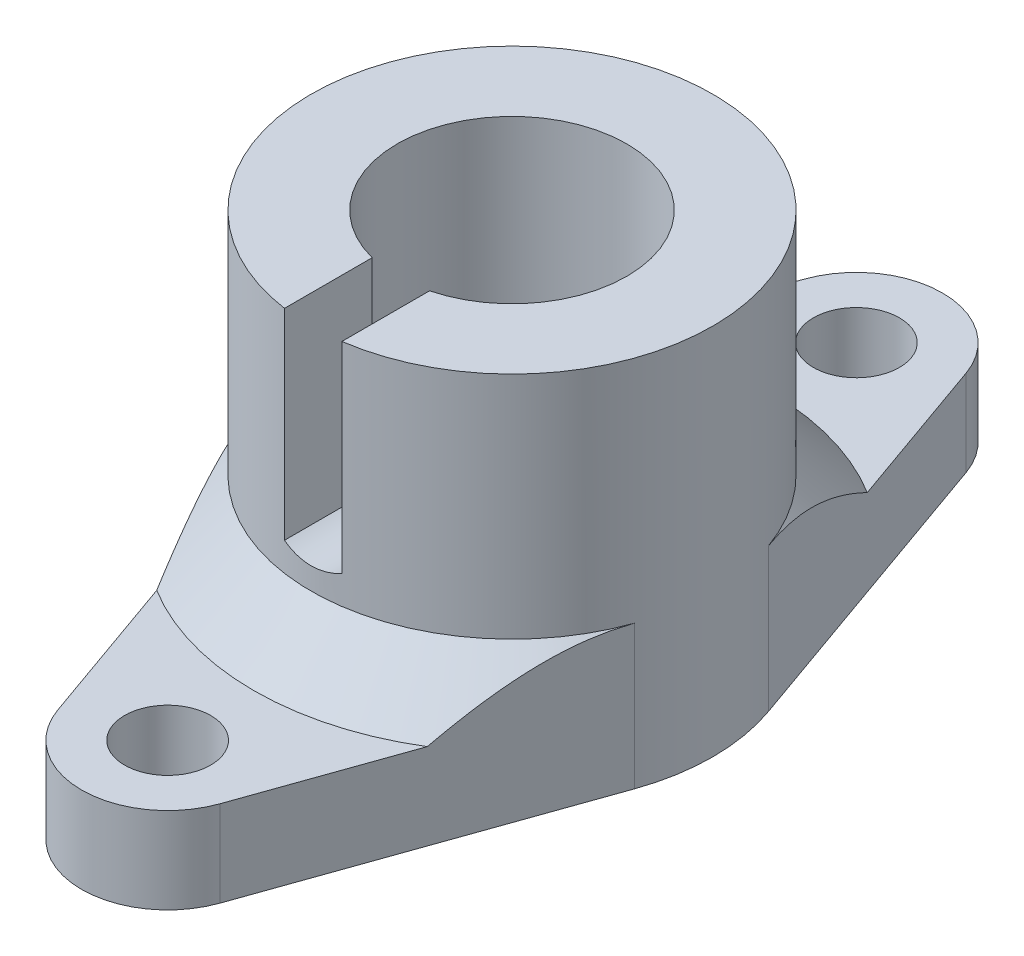
ISO-10303-21;
HEADER;
FILE_DESCRIPTION(('STEP AP214'),'2;1');
FILE_NAME('part.step','',(''),(''),'','','');
FILE_SCHEMA(('AUTOMOTIVE_DESIGN { 1 0 10303 214 1 1 1 1 }'));
ENDSEC;
DATA;
#1=APPLICATION_CONTEXT('core data for automotive mechanical design processes');
#2=APPLICATION_PROTOCOL_DEFINITION('international standard','automotive_design',2000,#1);
#3=PRODUCT_CONTEXT('',#1,'mechanical');
#4=PRODUCT('Part','Part','',(#3));
#5=PRODUCT_RELATED_PRODUCT_CATEGORY('part','',(#4));
#6=PRODUCT_DEFINITION_FORMATION('','',#4);
#7=PRODUCT_DEFINITION_CONTEXT('part definition',#1,'design');
#8=PRODUCT_DEFINITION('design','',#6,#7);
#9=PRODUCT_DEFINITION_SHAPE('','',#8);
#10=(LENGTH_UNIT() NAMED_UNIT(*) SI_UNIT(.MILLI.,.METRE.));
#11=(NAMED_UNIT(*) PLANE_ANGLE_UNIT() SI_UNIT($,.RADIAN.));
#12=(NAMED_UNIT(*) SI_UNIT($,.STERADIAN.) SOLID_ANGLE_UNIT());
#13=UNCERTAINTY_MEASURE_WITH_UNIT(LENGTH_MEASURE(1.E-05),#10,'distance_accuracy_value','');
#14=(GEOMETRIC_REPRESENTATION_CONTEXT(3) GLOBAL_UNCERTAINTY_ASSIGNED_CONTEXT((#13)) GLOBAL_UNIT_ASSIGNED_CONTEXT((#10,
#11,#12)) REPRESENTATION_CONTEXT('',''));
#15=CARTESIAN_POINT('',(0.,0.,0.));
#16=DIRECTION('',(0.,0.,1.));
#17=DIRECTION('',(1.,0.,0.));
#18=AXIS2_PLACEMENT_3D('',#15,#16,#17);
#19=CARTESIAN_POINT('',(0.,10.,0.));
#20=DIRECTION('',(0.,1.,0.));
#21=DIRECTION('',(0.,0.,1.));
#22=AXIS2_PLACEMENT_3D('',#19,#20,#21);
#23=PLANE('',#22);
#24=DIRECTION('',(0.,0.,1.));
#25=VECTOR('',#24,1.);
#26=CARTESIAN_POINT('',(-1.,10.,7.));
#27=LINE('',#26,#25);
#28=CARTESIAN_POINT('',(-1.,10.,3.87298334620742));
#29=VERTEX_POINT('',#28);
#30=CARTESIAN_POINT('',(-1.,10.,6.92820323027551));
#31=VERTEX_POINT('',#30);
#32=EDGE_CURVE('E186',#29,#31,#27,.T.);
#33=ORIENTED_EDGE('',*,*,#32,.F.);
#34=CARTESIAN_POINT('',(0.,10.,0.));
#35=DIRECTION('',(0.,1.,0.));
#36=DIRECTION('',(0.,0.,1.));
#37=AXIS2_PLACEMENT_3D('',#34,#35,#36);
#38=CIRCLE('',#37,4.);
#39=CARTESIAN_POINT('',(1.,10.,3.87298334620742));
#40=VERTEX_POINT('',#39);
#41=EDGE_CURVE('E245',#40,#29,#38,.T.);
#42=ORIENTED_EDGE('',*,*,#41,.F.);
#43=DIRECTION('',(0.,0.,1.));
#44=VECTOR('',#43,1.);
#45=CARTESIAN_POINT('',(1.,10.,7.));
#46=LINE('',#45,#44);
#47=CARTESIAN_POINT('',(1.,10.,6.92820323027551));
#48=VERTEX_POINT('',#47);
#49=EDGE_CURVE('E189',#40,#48,#46,.T.);
#50=ORIENTED_EDGE('',*,*,#49,.T.);
#51=CARTESIAN_POINT('',(0.,10.,0.));
#52=DIRECTION('',(0.,1.,0.));
#53=DIRECTION('',(0.,0.,1.));
#54=AXIS2_PLACEMENT_3D('',#51,#52,#53);
#55=CIRCLE('',#54,7.);
#56=EDGE_CURVE('E228',#48,#31,#55,.T.);
#57=ORIENTED_EDGE('',*,*,#56,.T.);
#58=EDGE_LOOP('',(#33,#42,#50,#57));
#59=FACE_BOUND('',#58,.T.);
#60=ADVANCED_FACE('F44',(#59),#23,.T.);
#61=CARTESIAN_POINT('',(0.,10.,0.));
#62=DIRECTION('',(0.,-1.,0.));
#63=DIRECTION('',(0.,0.,-1.));
#64=AXIS2_PLACEMENT_3D('',#61,#62,#63);
#65=CYLINDRICAL_SURFACE('',#64,7.);
#66=CARTESIAN_POINT('',(1.,3.,6.92820323027551));
#67=CARTESIAN_POINT('',(0.946010806745878,2.97300649768495,6.93599801640342));
#68=CARTESIAN_POINT('',(0.890894552130974,2.94818190206135,6.9433060423228));
#69=CARTESIAN_POINT('',(0.778705426420527,2.90303081568562,6.95678158016357));
#70=CARTESIAN_POINT('',(0.721632250509211,2.88270502939087,6.96294891344191));
#71=CARTESIAN_POINT('',(0.548208676947282,2.82880857866341,6.97946117582955));
#72=CARTESIAN_POINT('',(0.429409920284121,2.80219662615952,6.98785273447074));
#73=CARTESIAN_POINT('',(0.188623589553656,2.76857830678596,6.99849899477172));
#74=CARTESIAN_POINT('',(0.0666305435886491,2.76160815212066,7.0007423612323));
#75=CARTESIAN_POINT('',(-0.176793022976455,2.76761291838919,6.99882421205708));
#76=CARTESIAN_POINT('',(-0.298223713298514,2.78058136670916,6.99466477494525));
#77=CARTESIAN_POINT('',(-0.518906818506631,2.82252959364398,6.98147978008605));
#78=CARTESIAN_POINT('',(-0.618733573987294,2.84878796606671,6.97328630421981));
#79=CARTESIAN_POINT('',(-0.764761919896258,2.89814672865556,6.9582717606271));
#80=CARTESIAN_POINT('',(-0.812838014642447,2.91627082585687,6.95281010910982));
#81=CARTESIAN_POINT('',(-0.907548197136564,2.95574282698545,6.94108319991622));
#82=CARTESIAN_POINT('',(-0.954182269750846,2.97709076473224,6.93481793380972));
#83=CARTESIAN_POINT('',(-0.999999999999999,3.,6.92820323027551));
#84=B_SPLINE_CURVE_WITH_KNOTS('',3,(#66,#67,#68,#69,#70,#71,#72,#73,#74,#75,#76,#77,#78,#79,#80,
#81,#82,#83),.UNSPECIFIED.,.F.,.F.,(4,2,2,2,2,2,2,2,4),(0.,0.182484883344135,0.364998321358469,
0.729208729260032,1.09409016841291,1.45885318211515,1.76839055356223,1.92328403407926,
2.07817913961168),.UNSPECIFIED.);
#85=CARTESIAN_POINT('',(1.,3.,6.92820323027551));
#86=VERTEX_POINT('',#85);
#87=CARTESIAN_POINT('',(-0.999999999999999,3.,6.92820323027551));
#88=VERTEX_POINT('',#87);
#89=EDGE_CURVE('E188',#86,#88,#84,.T.);
#90=ORIENTED_EDGE('',*,*,#89,.T.);
#91=DIRECTION('',(0.,-1.,0.));
#92=VECTOR('',#91,1.);
#93=CARTESIAN_POINT('',(-1.,10.,6.92820323027551));
#94=LINE('',#93,#92);
#95=EDGE_CURVE('E258',#88,#31,#94,.F.);
#96=ORIENTED_EDGE('',*,*,#95,.T.);
#97=ORIENTED_EDGE('',*,*,#56,.F.);
#98=DIRECTION('',(0.,-1.,0.));
#99=VECTOR('',#98,1.);
#100=CARTESIAN_POINT('',(1.,10.,6.92820323027551));
#101=LINE('',#100,#99);
#102=EDGE_CURVE('E202',#86,#48,#101,.F.);
#103=ORIENTED_EDGE('',*,*,#102,.F.);
#104=EDGE_LOOP('',(#90,#96,#97,#103));
#105=FACE_BOUND('',#104,.T.);
#106=CARTESIAN_POINT('',(0.,2.,0.));
#107=DIRECTION('',(0.,-1.,0.));
#108=DIRECTION('',(0.,0.,-1.));
#109=AXIS2_PLACEMENT_3D('',#106,#107,#108);
#110=CIRCLE('',#109,7.);
#111=CARTESIAN_POINT('',(6.59966329107445,2.,-2.33333333333334));
#112=VERTEX_POINT('',#111);
#113=CARTESIAN_POINT('',(-6.59966329107444,2.,-2.33333333333333));
#114=VERTEX_POINT('',#113);
#115=EDGE_CURVE('E265',#112,#114,#110,.F.);
#116=ORIENTED_EDGE('',*,*,#115,.T.);
#117=DIRECTION('',(0.,1.,0.));
#118=VECTOR('',#117,1.);
#119=CARTESIAN_POINT('',(-6.59966329107445,-3.,-2.33333333333334));
#120=LINE('',#119,#118);
#121=CARTESIAN_POINT('',(-6.59966329107445,-3.,-2.33333333333334));
#122=VERTEX_POINT('',#121);
#123=EDGE_CURVE('E267',#122,#114,#120,.T.);
#124=ORIENTED_EDGE('',*,*,#123,.F.);
#125=CARTESIAN_POINT('',(0.,-3.,0.));
#126=DIRECTION('',(0.,-1.,0.));
#127=DIRECTION('',(0.,0.,-1.));
#128=AXIS2_PLACEMENT_3D('',#125,#126,#127);
#129=CIRCLE('',#128,7.);
#130=CARTESIAN_POINT('',(-6.59966329107445,-3.,2.33333333333334));
#131=VERTEX_POINT('',#130);
#132=EDGE_CURVE('E340',#131,#122,#129,.T.);
#133=ORIENTED_EDGE('',*,*,#132,.F.);
#134=DIRECTION('',(0.,1.,0.));
#135=VECTOR('',#134,1.);
#136=CARTESIAN_POINT('',(-6.59966329107445,-3.,2.33333333333334));
#137=LINE('',#136,#135);
#138=CARTESIAN_POINT('',(-6.59966329107445,2.,2.33333333333334));
#139=VERTEX_POINT('',#138);
#140=EDGE_CURVE('E182',#131,#139,#137,.T.);
#141=ORIENTED_EDGE('',*,*,#140,.T.);
#142=CARTESIAN_POINT('',(0.,2.,0.));
#143=DIRECTION('',(0.,-1.,0.));
#144=DIRECTION('',(0.,0.,-1.));
#145=AXIS2_PLACEMENT_3D('',#142,#143,#144);
#146=CIRCLE('',#145,7.);
#147=CARTESIAN_POINT('',(6.59966329107444,2.,2.33333333333333));
#148=VERTEX_POINT('',#147);
#149=EDGE_CURVE('E275',#139,#148,#146,.F.);
#150=ORIENTED_EDGE('',*,*,#149,.T.);
#151=DIRECTION('',(0.,1.,0.));
#152=VECTOR('',#151,1.);
#153=CARTESIAN_POINT('',(6.59966329107445,-3.,2.33333333333334));
#154=LINE('',#153,#152);
#155=CARTESIAN_POINT('',(6.59966329107445,-3.,2.33333333333334));
#156=VERTEX_POINT('',#155);
#157=EDGE_CURVE('E339',#156,#148,#154,.T.);
#158=ORIENTED_EDGE('',*,*,#157,.F.);
#159=CARTESIAN_POINT('',(6.59966329107445,-3.,-2.33333333333334));
#160=VERTEX_POINT('',#159);
#161=EDGE_CURVE('E170',#160,#156,#129,.T.);
#162=ORIENTED_EDGE('',*,*,#161,.F.);
#163=DIRECTION('',(0.,1.,0.));
#164=VECTOR('',#163,1.);
#165=CARTESIAN_POINT('',(6.59966329107445,-3.,-2.33333333333334));
#166=LINE('',#165,#164);
#167=EDGE_CURVE('E269',#160,#112,#166,.T.);
#168=ORIENTED_EDGE('',*,*,#167,.T.);
#169=EDGE_LOOP('',(#116,#124,#133,#141,#150,#158,#162,#168));
#170=FACE_BOUND('',#169,.T.);
#171=ADVANCED_FACE('F204',(#105,#170),#65,.T.);
#172=CARTESIAN_POINT('',(0.,10.,0.));
#173=DIRECTION('',(0.,-1.,0.));
#174=DIRECTION('',(0.,0.,-1.));
#175=AXIS2_PLACEMENT_3D('',#172,#173,#174);
#176=CYLINDRICAL_SURFACE('',#175,4.);
#177=DIRECTION('',(0.,-1.,0.));
#178=VECTOR('',#177,1.);
#179=CARTESIAN_POINT('',(-1.,10.,3.87298334620742));
#180=LINE('',#179,#178);
#181=CARTESIAN_POINT('',(-0.999999999999999,3.,3.87298334620742));
#182=VERTEX_POINT('',#181);
#183=EDGE_CURVE('E253',#182,#29,#180,.F.);
#184=ORIENTED_EDGE('',*,*,#183,.F.);
#185=CARTESIAN_POINT('',(1.,3.,3.87298334620742));
#186=CARTESIAN_POINT('',(0.950188517099722,2.97508933958767,3.88585088189177));
#187=CARTESIAN_POINT('',(0.899277846788459,2.95196544868543,3.89796465323832));
#188=CARTESIAN_POINT('',(0.795514839442824,2.90947468734503,3.92045447989143));
#189=CARTESIAN_POINT('',(0.742661636034023,2.89010951809513,3.93082974806663));
#190=CARTESIAN_POINT('',(0.635411059299217,2.85537339290339,3.94958367100883));
#191=CARTESIAN_POINT('',(0.58101659433077,2.83999540612524,3.95796583813448));
#192=CARTESIAN_POINT('',(0.470967036450821,2.81335871011157,3.97256569752814));
#193=CARTESIAN_POINT('',(0.415312156422224,2.8020993106799,3.97878375245131));
#194=CARTESIAN_POINT('',(0.246582686802666,2.77465156165259,3.99398572969428));
#195=CARTESIAN_POINT('',(0.132048493849422,2.76489306891693,3.99946281301305));
#196=CARTESIAN_POINT('',(-0.0972094396441492,2.76310668058718,4.00046132666002));
#197=CARTESIAN_POINT('',(-0.211933193699685,2.7710801090207,3.9959820135525));
#198=CARTESIAN_POINT('',(-0.384039280941791,2.79634259434987,3.98196747194808));
#199=CARTESIAN_POINT('',(-0.442706272556058,2.80738554503555,3.97585667456761));
#200=CARTESIAN_POINT('',(-0.558714272249034,2.83404165072753,3.96121815743422));
#201=CARTESIAN_POINT('',(-0.616054947088828,2.84965594111546,3.95268983725895));
#202=CARTESIAN_POINT('',(-0.729103681035262,2.88530615865487,3.93340858219508));
#203=CARTESIAN_POINT('',(-0.784807518595089,2.90535254622222,3.92265038828784));
#204=CARTESIAN_POINT('',(-0.894078921624876,2.94960941824284,3.89919979606198));
#205=CARTESIAN_POINT('',(-0.94764766335125,2.97381756973795,3.88650848184369));
#206=CARTESIAN_POINT('',(-0.999999999999999,3.,3.87298334620742));
#207=B_SPLINE_CURVE_WITH_KNOTS('',3,(#185,#186,#187,#188,#189,#190,#191,#192,#193,#194,#195,
#196,#197,#198,#199,#200,#201,#202,#203,#204,#205,#206),.UNSPECIFIED.,.F.,.F.,(4,2,2,2,2,2,2,2,
2,2,4),(0.,0.171451164096802,0.342979746548265,0.514203773126166,0.685399092685342,
1.02875375332103,1.37213405282071,1.55195811410159,1.7318268761507,1.91212477538504,
2.09232193271541),.UNSPECIFIED.);
#208=CARTESIAN_POINT('',(1.,3.,3.87298334620742));
#209=VERTEX_POINT('',#208);
#210=EDGE_CURVE('E220',#209,#182,#207,.T.);
#211=ORIENTED_EDGE('',*,*,#210,.F.);
#212=DIRECTION('',(0.,-1.,0.));
#213=VECTOR('',#212,1.);
#214=CARTESIAN_POINT('',(1.,10.,3.87298334620742));
#215=LINE('',#214,#213);
#216=EDGE_CURVE('E227',#209,#40,#215,.F.);
#217=ORIENTED_EDGE('',*,*,#216,.T.);
#218=ORIENTED_EDGE('',*,*,#41,.T.);
#219=EDGE_LOOP('',(#184,#211,#217,#218));
#220=FACE_BOUND('',#219,.T.);
#221=CARTESIAN_POINT('',(0.,0.,0.));
#222=DIRECTION('',(0.,1.,0.));
#223=DIRECTION('',(0.,0.,1.));
#224=AXIS2_PLACEMENT_3D('',#221,#222,#223);
#225=CIRCLE('',#224,4.);
#226=CARTESIAN_POINT('',(0.,0.,4.));
#227=VERTEX_POINT('',#226);
#228=EDGE_CURVE('E255',#227,#227,#225,.T.);
#229=ORIENTED_EDGE('',*,*,#228,.F.);
#230=EDGE_LOOP('',(#229));
#231=FACE_BOUND('',#230,.T.);
#232=ADVANCED_FACE('F231',(#220,#231),#176,.F.);
#233=CARTESIAN_POINT('',(-0.999999999999999,0.,7.));
#234=DIRECTION('',(-1.,0.,0.));
#235=DIRECTION('',(0.,-1.,0.));
#236=AXIS2_PLACEMENT_3D('',#233,#234,#235);
#237=PLANE('',#236);
#238=DIRECTION('',(0.,0.,1.));
#239=VECTOR('',#238,1.);
#240=CARTESIAN_POINT('',(-0.999999999999999,3.,7.));
#241=LINE('',#240,#239);
#242=EDGE_CURVE('E177',#182,#88,#241,.T.);
#243=ORIENTED_EDGE('',*,*,#242,.F.);
#244=ORIENTED_EDGE('',*,*,#183,.T.);
#245=ORIENTED_EDGE('',*,*,#32,.T.);
#246=ORIENTED_EDGE('',*,*,#95,.F.);
#247=EDGE_LOOP('',(#243,#244,#245,#246));
#248=FACE_BOUND('',#247,.T.);
#249=ADVANCED_FACE('F216',(#248),#237,.F.);
#250=CARTESIAN_POINT('',(1.,0.,7.));
#251=DIRECTION('',(-1.,0.,0.));
#252=DIRECTION('',(0.,-1.,0.));
#253=AXIS2_PLACEMENT_3D('',#250,#251,#252);
#254=PLANE('',#253);
#255=ORIENTED_EDGE('',*,*,#102,.T.);
#256=ORIENTED_EDGE('',*,*,#49,.F.);
#257=ORIENTED_EDGE('',*,*,#216,.F.);
#258=DIRECTION('',(0.,0.,1.));
#259=VECTOR('',#258,1.);
#260=CARTESIAN_POINT('',(1.,3.,7.));
#261=LINE('',#260,#259);
#262=EDGE_CURVE('E180',#209,#86,#261,.T.);
#263=ORIENTED_EDGE('',*,*,#262,.T.);
#264=EDGE_LOOP('',(#255,#256,#257,#263));
#265=FACE_BOUND('',#264,.T.);
#266=ADVANCED_FACE('F213',(#265),#254,.T.);
#267=CARTESIAN_POINT('',(0.,5.00000000000006,7.));
#268=DIRECTION('',(0.,0.,1.));
#269=DIRECTION('',(1.,0.,0.));
#270=AXIS2_PLACEMENT_3D('',#267,#268,#269);
#271=CYLINDRICAL_SURFACE('',#270,2.23606797749984);
#272=ORIENTED_EDGE('',*,*,#262,.F.);
#273=ORIENTED_EDGE('',*,*,#210,.T.);
#274=ORIENTED_EDGE('',*,*,#242,.T.);
#275=ORIENTED_EDGE('',*,*,#89,.F.);
#276=EDGE_LOOP('',(#272,#273,#274,#275));
#277=FACE_BOUND('',#276,.T.);
#278=ADVANCED_FACE('F207',(#277),#271,.F.);
#279=CARTESIAN_POINT('',(0.,0.,0.));
#280=DIRECTION('',(0.,-1.,0.));
#281=DIRECTION('',(0.,0.,-1.));
#282=AXIS2_PLACEMENT_3D('',#279,#280,#281);
#283=PLANE('',#282);
#284=ORIENTED_EDGE('',*,*,#228,.T.);
#285=EDGE_LOOP('',(#284));
#286=FACE_BOUND('',#285,.T.);
#287=ADVANCED_FACE('F212',(#286),#283,.F.);
#288=DIRECTION('',(0.333333333333334,0.,-0.942809041582063));
#289=VECTOR('',#288,1.);
#290=CARTESIAN_POINT('',(-6.59966329107445,0.,-2.33333333333334));
#291=LINE('',#290,#289);
#292=CARTESIAN_POINT('',(-4.71404520791033,0.,-7.66666666666664));
#293=VERTEX_POINT('',#292);
#294=CARTESIAN_POINT('',(-2.82842712474619,0.,-13.));
#295=VERTEX_POINT('',#294);
#296=EDGE_CURVE('E336',#293,#295,#291,.T.);
#297=ORIENTED_EDGE('',*,*,#296,.F.);
#298=CARTESIAN_POINT('',(0.,0.,0.));
#299=DIRECTION('',(0.,-1.,0.));
#300=DIRECTION('',(0.,0.,-1.));
#301=AXIS2_PLACEMENT_3D('',#298,#299,#300);
#302=CIRCLE('',#301,8.99999999999998);
#303=CARTESIAN_POINT('',(4.71404520791033,0.,-7.66666666666664));
#304=VERTEX_POINT('',#303);
#305=EDGE_CURVE('E274',#293,#304,#302,.T.);
#306=ORIENTED_EDGE('',*,*,#305,.T.);
#307=DIRECTION('',(-0.333333333333334,0.,-0.942809041582063));
#308=VECTOR('',#307,1.);
#309=CARTESIAN_POINT('',(6.59966329107445,0.,-2.33333333333334));
#310=LINE('',#309,#308);
#311=CARTESIAN_POINT('',(2.82842712474619,0.,-13.));
#312=VERTEX_POINT('',#311);
#313=EDGE_CURVE('E357',#304,#312,#310,.T.);
#314=ORIENTED_EDGE('',*,*,#313,.T.);
#315=CARTESIAN_POINT('',(0.,0.,-12.));
#316=DIRECTION('',(0.,-1.,0.));
#317=DIRECTION('',(0.,0.,-1.));
#318=AXIS2_PLACEMENT_3D('',#315,#316,#317);
#319=CIRCLE('',#318,3.);
#320=EDGE_CURVE('E359',#312,#295,#319,.F.);
#321=ORIENTED_EDGE('',*,*,#320,.T.);
#322=EDGE_LOOP('',(#297,#306,#314,#321));
#323=FACE_BOUND('',#322,.T.);
#324=CARTESIAN_POINT('',(0.,0.,-12.));
#325=DIRECTION('',(0.,-1.,0.));
#326=DIRECTION('',(0.,0.,-1.));
#327=AXIS2_PLACEMENT_3D('',#324,#325,#326);
#328=CIRCLE('',#327,1.5);
#329=CARTESIAN_POINT('',(0.,0.,-13.5));
#330=VERTEX_POINT('',#329);
#331=EDGE_CURVE('E354',#330,#330,#328,.F.);
#332=ORIENTED_EDGE('',*,*,#331,.F.);
#333=EDGE_LOOP('',(#332));
#334=FACE_BOUND('',#333,.T.);
#335=ADVANCED_FACE('F312',(#323,#334),#283,.F.);
#336=CARTESIAN_POINT('',(6.59966329107445,-3.,2.33333333333334));
#337=DIRECTION('',(-0.942809041582063,0.,-0.333333333333334));
#338=DIRECTION('',(-0.333333333333334,0.,0.942809041582063));
#339=AXIS2_PLACEMENT_3D('',#336,#337,#338);
#340=PLANE('',#339);
#341=ORIENTED_EDGE('',*,*,#157,.T.);
#342=CARTESIAN_POINT('',(6.59966329107444,2.,2.33333333333333));
#343=CARTESIAN_POINT('',(6.56379083725605,2.00001252856495,2.43479595474449));
#344=CARTESIAN_POINT('',(6.52791982372579,1.997518581247,2.53625450240561));
#345=CARTESIAN_POINT('',(6.45625900047216,1.98761085194684,2.73894191867782));
#346=CARTESIAN_POINT('',(6.42046917850424,1.9801978692311,2.84017082192172));
#347=CARTESIAN_POINT('',(6.34910575868481,1.96056394846722,3.04201705425366));
#348=CARTESIAN_POINT('',(6.31353187800726,1.94835224521634,3.14263518329453));
#349=CARTESIAN_POINT('',(6.24259639218225,1.91929704387491,3.34327103550903));
#350=CARTESIAN_POINT('',(6.20723479393475,1.90245339605306,3.44328873916662));
#351=CARTESIAN_POINT('',(6.10275257038662,1.84594004242407,3.73880909430395));
#352=CARTESIAN_POINT('',(6.03400415131753,1.7999340513034,3.93325898758238));
#353=CARTESIAN_POINT('',(5.89782251375967,1.69286069519509,4.31843882514339));
#354=CARTESIAN_POINT('',(5.83038983813374,1.63178724962269,4.50916723397799));
#355=CARTESIAN_POINT('',(5.67207528985783,1.47159934543801,4.95694839656352));
#356=CARTESIAN_POINT('',(5.58183510686107,1.36679447065154,5.21218617789361));
#357=CARTESIAN_POINT('',(5.40402064612393,1.13820382528847,5.71512142181465));
#358=CARTESIAN_POINT('',(5.31644880426343,1.01440129962642,5.96281199469686));
#359=CARTESIAN_POINT('',(5.18587438798423,0.816105480123807,6.33213221549887));
#360=CARTESIAN_POINT('',(5.14194996805534,0.746985317372526,6.45636923626449));
#361=CARTESIAN_POINT('',(5.05470672419915,0.60536505249335,6.70313039363816));
#362=CARTESIAN_POINT('',(5.01138793220835,0.532864772989571,6.82565443991619));
#363=CARTESIAN_POINT('',(4.92542954980956,0.385106933546214,7.06878146029224));
#364=CARTESIAN_POINT('',(4.88278847215458,0.309857130755406,7.18938864096));
#365=CARTESIAN_POINT('',(4.79803399039657,0.156779211984358,7.42911051610814));
#366=CARTESIAN_POINT('',(4.75592048970203,0.0789515777635421,7.54822548379061));
#367=CARTESIAN_POINT('',(4.71404520791033,0.,7.66666666666664));
#368=B_SPLINE_CURVE_WITH_KNOTS('',3,(#342,#343,#344,#345,#346,#347,#348,#349,#350,#351,#352,
#353,#354,#355,#356,#357,#358,#359,#360,#361,#362,#363,#364,#365,#366,#367),.UNSPECIFIED.,.F.,
.F.,(4,2,2,2,2,2,2,2,2,2,2,2,4),(0.,0.32281601580541,0.645579591886596,0.967725050511757,
1.28988092396918,1.92310450959943,2.55658405658534,3.42650233622971,4.29719230226453,
4.74355585015585,5.18994284795931,5.63515527566267,6.08028496392075),.UNSPECIFIED.);
#369=CARTESIAN_POINT('',(4.71404520791033,0.,7.66666666666664));
#370=VERTEX_POINT('',#369);
#371=EDGE_CURVE('E59',#148,#370,#368,.T.);
#372=ORIENTED_EDGE('',*,*,#371,.T.);
#373=DIRECTION('',(-0.333333333333334,0.,0.942809041582063));
#374=VECTOR('',#373,1.);
#375=CARTESIAN_POINT('',(6.59966329107445,0.,2.33333333333334));
#376=LINE('',#375,#374);
#377=CARTESIAN_POINT('',(2.82842712474619,0.,13.));
#378=VERTEX_POINT('',#377);
#379=EDGE_CURVE('E175',#370,#378,#376,.T.);
#380=ORIENTED_EDGE('',*,*,#379,.T.);
#381=DIRECTION('',(0.,1.,0.));
#382=VECTOR('',#381,1.);
#383=CARTESIAN_POINT('',(2.82842712474619,-3.,13.));
#384=LINE('',#383,#382);
#385=CARTESIAN_POINT('',(2.82842712474619,-3.,13.));
#386=VERTEX_POINT('',#385);
#387=EDGE_CURVE('E156',#386,#378,#384,.T.);
#388=ORIENTED_EDGE('',*,*,#387,.F.);
#389=DIRECTION('',(-0.333333333333334,0.,0.942809041582063));
#390=VECTOR('',#389,1.);
#391=CARTESIAN_POINT('',(6.59966329107445,-3.,2.33333333333334));
#392=LINE('',#391,#390);
#393=EDGE_CURVE('E163',#156,#386,#392,.T.);
#394=ORIENTED_EDGE('',*,*,#393,.F.);
#395=EDGE_LOOP('',(#341,#372,#380,#388,#394));
#396=FACE_BOUND('',#395,.T.);
#397=ADVANCED_FACE('F174',(#396),#340,.F.);
#398=CARTESIAN_POINT('',(0.,-3.,12.));
#399=DIRECTION('',(0.,1.,0.));
#400=DIRECTION('',(0.,0.,1.));
#401=AXIS2_PLACEMENT_3D('',#398,#399,#400);
#402=CYLINDRICAL_SURFACE('',#401,3.);
#403=CARTESIAN_POINT('',(0.,0.,12.));
#404=DIRECTION('',(0.,-1.,0.));
#405=DIRECTION('',(0.,0.,-1.));
#406=AXIS2_PLACEMENT_3D('',#403,#404,#405);
#407=CIRCLE('',#406,3.);
#408=CARTESIAN_POINT('',(-2.82842712474619,0.,13.));
#409=VERTEX_POINT('',#408);
#410=EDGE_CURVE('E337',#378,#409,#407,.T.);
#411=ORIENTED_EDGE('',*,*,#410,.T.);
#412=DIRECTION('',(0.,1.,0.));
#413=VECTOR('',#412,1.);
#414=CARTESIAN_POINT('',(-2.82842712474619,-3.,13.));
#415=LINE('',#414,#413);
#416=CARTESIAN_POINT('',(-2.82842712474619,-3.,13.));
#417=VERTEX_POINT('',#416);
#418=EDGE_CURVE('E158',#417,#409,#415,.T.);
#419=ORIENTED_EDGE('',*,*,#418,.F.);
#420=CARTESIAN_POINT('',(0.,-3.,12.));
#421=DIRECTION('',(0.,-1.,0.));
#422=DIRECTION('',(0.,0.,-1.));
#423=AXIS2_PLACEMENT_3D('',#420,#421,#422);
#424=CIRCLE('',#423,3.);
#425=EDGE_CURVE('E151',#386,#417,#424,.T.);
#426=ORIENTED_EDGE('',*,*,#425,.F.);
#427=ORIENTED_EDGE('',*,*,#387,.T.);
#428=EDGE_LOOP('',(#411,#419,#426,#427));
#429=FACE_BOUND('',#428,.T.);
#430=ADVANCED_FACE('F154',(#429),#402,.T.);
#431=CARTESIAN_POINT('',(-6.59966329107445,-3.,2.33333333333334));
#432=DIRECTION('',(-0.942809041582063,0.,0.333333333333334));
#433=DIRECTION('',(0.333333333333334,0.,0.942809041582063));
#434=AXIS2_PLACEMENT_3D('',#431,#432,#433);
#435=PLANE('',#434);
#436=DIRECTION('',(0.333333333333334,0.,0.942809041582063));
#437=VECTOR('',#436,1.);
#438=CARTESIAN_POINT('',(-6.59966329107445,0.,2.33333333333334));
#439=LINE('',#438,#437);
#440=CARTESIAN_POINT('',(-4.71404520791033,0.,7.66666666666664));
#441=VERTEX_POINT('',#440);
#442=EDGE_CURVE('E333',#441,#409,#439,.T.);
#443=ORIENTED_EDGE('',*,*,#442,.F.);
#444=CARTESIAN_POINT('',(-4.71404520791033,0.,7.66666666666664));
#445=CARTESIAN_POINT('',(-4.75768432849239,0.0822758042762983,7.54323659431226));
#446=CARTESIAN_POINT('',(-4.80158210174785,0.16333264987229,7.41907494172057));
#447=CARTESIAN_POINT('',(-4.88995350827993,0.322633619698623,7.16912285843325));
#448=CARTESIAN_POINT('',(-4.93442726458205,0.400877129081661,7.04333207976898));
#449=CARTESIAN_POINT('',(-5.02413581624304,0.554389591288177,6.78959797892936));
#450=CARTESIAN_POINT('',(-5.06937261524379,0.629648050215506,6.66164898959893));
#451=CARTESIAN_POINT('',(-5.160510321747,0.776426553605261,6.4038726284381));
#452=CARTESIAN_POINT('',(-5.20641118757597,0.847946831368914,6.2740453744781));
#453=CARTESIAN_POINT('',(-5.34276331924602,1.0524667057951,5.88838330674556));
#454=CARTESIAN_POINT('',(-5.43422361835838,1.17951946259009,5.62969451589877));
#455=CARTESIAN_POINT('',(-5.62004035196248,1.41231250512525,5.10412542634121));
#456=CARTESIAN_POINT('',(-5.71439317777707,1.51807819374272,4.83725533451078));
#457=CARTESIAN_POINT('',(-5.87341807732319,1.67097230937674,4.38746499512448));
#458=CARTESIAN_POINT('',(-5.93726522623643,1.7258073447878,4.20687798730057));
#459=CARTESIAN_POINT('',(-6.06608864596081,1.82174800144311,3.84251033264957));
#460=CARTESIAN_POINT('',(-6.13106457864363,1.86285766200061,3.65873064219381));
#461=CARTESIAN_POINT('',(-6.26300010005564,1.93024217918121,3.28556063471453));
#462=CARTESIAN_POINT('',(-6.32997470395809,1.95625864794915,3.09612784836771));
#463=CARTESIAN_POINT('',(-6.43084644960152,1.98242616249305,2.81081946686934));
#464=CARTESIAN_POINT('',(-6.46456845131107,1.98900591535313,2.7154392425333));
#465=CARTESIAN_POINT('',(-6.53207991887235,1.99779651543177,2.52448797645155));
#466=CARTESIAN_POINT('',(-6.565869392916,2.00000679521546,2.42891691153559));
#467=CARTESIAN_POINT('',(-6.59966329107445,2.,2.33333333333333));
#468=B_SPLINE_CURVE_WITH_KNOTS('',3,(#444,#445,#446,#447,#448,#449,#450,#451,#452,#453,#454,
#455,#456,#457,#458,#459,#460,#461,#462,#463,#464,#465,#466,#467),.UNSPECIFIED.,.F.,.F.,(4,2,2,
2,2,2,2,2,2,2,2,4),(0.,0.463878007091449,0.927856784822717,1.39334351226554,1.85880115374068,
2.76522156165986,3.67055379616303,4.26783184020499,4.86493395286875,5.47197751526492,
5.77603353512196,6.08012903814982),.UNSPECIFIED.);
#469=EDGE_CURVE('E12',#441,#139,#468,.T.);
#470=ORIENTED_EDGE('',*,*,#469,.T.);
#471=ORIENTED_EDGE('',*,*,#140,.F.);
#472=DIRECTION('',(0.333333333333334,0.,0.942809041582063));
#473=VECTOR('',#472,1.);
#474=CARTESIAN_POINT('',(-6.59966329107445,-3.,2.33333333333334));
#475=LINE('',#474,#473);
#476=EDGE_CURVE('E162',#131,#417,#475,.T.);
#477=ORIENTED_EDGE('',*,*,#476,.T.);
#478=ORIENTED_EDGE('',*,*,#418,.T.);
#479=EDGE_LOOP('',(#443,#470,#471,#477,#478));
#480=FACE_BOUND('',#479,.T.);
#481=ADVANCED_FACE('F324',(#480),#435,.T.);
#482=CARTESIAN_POINT('',(-6.59966329107445,-3.,-2.33333333333334));
#483=DIRECTION('',(0.942809041582063,0.,0.333333333333334));
#484=DIRECTION('',(0.333333333333334,0.,-0.942809041582063));
#485=AXIS2_PLACEMENT_3D('',#482,#483,#484);
#486=PLANE('',#485);
#487=ORIENTED_EDGE('',*,*,#123,.T.);
#488=CARTESIAN_POINT('',(-6.59966329107444,2.,-2.33333333333333));
#489=CARTESIAN_POINT('',(-6.56379083725605,2.00001252856495,-2.43479595474449));
#490=CARTESIAN_POINT('',(-6.52791982372579,1.997518581247,-2.53625450240561));
#491=CARTESIAN_POINT('',(-6.45625900047216,1.98761085194684,-2.73894191867782));
#492=CARTESIAN_POINT('',(-6.42046917850424,1.9801978692311,-2.84017082192172));
#493=CARTESIAN_POINT('',(-6.34910575868481,1.96056394846722,-3.04201705425366));
#494=CARTESIAN_POINT('',(-6.31353187800726,1.94835224521634,-3.14263518329453));
#495=CARTESIAN_POINT('',(-6.24259639218225,1.91929704387491,-3.34327103550903));
#496=CARTESIAN_POINT('',(-6.20723479393475,1.90245339605306,-3.44328873916662));
#497=CARTESIAN_POINT('',(-6.10275257038662,1.84594004242407,-3.73880909430395));
#498=CARTESIAN_POINT('',(-6.03400415131753,1.7999340513034,-3.93325898758238));
#499=CARTESIAN_POINT('',(-5.89782251375967,1.69286069519509,-4.31843882514339));
#500=CARTESIAN_POINT('',(-5.83038983813374,1.63178724962269,-4.50916723397799));
#501=CARTESIAN_POINT('',(-5.67207528985783,1.47159934543801,-4.95694839656352));
#502=CARTESIAN_POINT('',(-5.58183510686107,1.36679447065154,-5.21218617789361));
#503=CARTESIAN_POINT('',(-5.40402064612393,1.13820382528847,-5.71512142181465));
#504=CARTESIAN_POINT('',(-5.31644880426343,1.01440129962642,-5.96281199469686));
#505=CARTESIAN_POINT('',(-5.18587438798423,0.816105480123807,-6.33213221549887));
#506=CARTESIAN_POINT('',(-5.14194996805534,0.746985317372526,-6.45636923626449));
#507=CARTESIAN_POINT('',(-5.05470672419915,0.60536505249335,-6.70313039363816));
#508=CARTESIAN_POINT('',(-5.01138793220835,0.532864772989571,-6.82565443991619));
#509=CARTESIAN_POINT('',(-4.92542954980956,0.385106933546214,-7.06878146029224));
#510=CARTESIAN_POINT('',(-4.88278847215458,0.309857130755406,-7.18938864096));
#511=CARTESIAN_POINT('',(-4.79803399039657,0.156779211984358,-7.42911051610814));
#512=CARTESIAN_POINT('',(-4.75592048970203,0.0789515777635421,-7.54822548379061));
#513=CARTESIAN_POINT('',(-4.71404520791033,0.,-7.66666666666664));
#514=B_SPLINE_CURVE_WITH_KNOTS('',3,(#488,#489,#490,#491,#492,#493,#494,#495,#496,#497,#498,
#499,#500,#501,#502,#503,#504,#505,#506,#507,#508,#509,#510,#511,#512,#513),.UNSPECIFIED.,.F.,
.F.,(4,2,2,2,2,2,2,2,2,2,2,2,4),(0.,0.32281601580541,0.645579591886596,0.967725050511757,
1.28988092396918,1.92310450959943,2.55658405658534,3.42650233622971,4.29719230226453,
4.74355585015585,5.18994284795931,5.63515527566267,6.08028496392075),.UNSPECIFIED.);
#515=EDGE_CURVE('E282',#114,#293,#514,.T.);
#516=ORIENTED_EDGE('',*,*,#515,.T.);
#517=ORIENTED_EDGE('',*,*,#296,.T.);
#518=DIRECTION('',(0.,1.,0.));
#519=VECTOR('',#518,1.);
#520=CARTESIAN_POINT('',(-2.82842712474619,-3.,-13.));
#521=LINE('',#520,#519);
#522=CARTESIAN_POINT('',(-2.82842712474619,-3.,-13.));
#523=VERTEX_POINT('',#522);
#524=EDGE_CURVE('E341',#523,#295,#521,.T.);
#525=ORIENTED_EDGE('',*,*,#524,.F.);
#526=DIRECTION('',(0.333333333333334,0.,-0.942809041582063));
#527=VECTOR('',#526,1.);
#528=CARTESIAN_POINT('',(-6.59966329107445,-3.,-2.33333333333334));
#529=LINE('',#528,#527);
#530=EDGE_CURVE('E376',#122,#523,#529,.T.);
#531=ORIENTED_EDGE('',*,*,#530,.F.);
#532=EDGE_LOOP('',(#487,#516,#517,#525,#531));
#533=FACE_BOUND('',#532,.T.);
#534=ADVANCED_FACE('F295',(#533),#486,.F.);
#535=CARTESIAN_POINT('',(0.,-3.,-12.));
#536=DIRECTION('',(0.,1.,0.));
#537=DIRECTION('',(0.,0.,1.));
#538=AXIS2_PLACEMENT_3D('',#535,#536,#537);
#539=CYLINDRICAL_SURFACE('',#538,3.);
#540=ORIENTED_EDGE('',*,*,#320,.F.);
#541=DIRECTION('',(0.,1.,0.));
#542=VECTOR('',#541,1.);
#543=CARTESIAN_POINT('',(2.82842712474619,-3.,-13.));
#544=LINE('',#543,#542);
#545=CARTESIAN_POINT('',(2.82842712474619,-3.,-13.));
#546=VERTEX_POINT('',#545);
#547=EDGE_CURVE('E346',#546,#312,#544,.T.);
#548=ORIENTED_EDGE('',*,*,#547,.F.);
#549=CARTESIAN_POINT('',(0.,-3.,-12.));
#550=DIRECTION('',(0.,-1.,0.));
#551=DIRECTION('',(0.,0.,-1.));
#552=AXIS2_PLACEMENT_3D('',#549,#550,#551);
#553=CIRCLE('',#552,3.);
#554=EDGE_CURVE('E373',#546,#523,#553,.F.);
#555=ORIENTED_EDGE('',*,*,#554,.T.);
#556=ORIENTED_EDGE('',*,*,#524,.T.);
#557=EDGE_LOOP('',(#540,#548,#555,#556));
#558=FACE_BOUND('',#557,.T.);
#559=ADVANCED_FACE('F331',(#558),#539,.T.);
#560=CARTESIAN_POINT('',(6.59966329107445,-3.,-2.33333333333334));
#561=DIRECTION('',(0.942809041582063,0.,-0.333333333333334));
#562=DIRECTION('',(-0.333333333333334,0.,-0.942809041582063));
#563=AXIS2_PLACEMENT_3D('',#560,#561,#562);
#564=PLANE('',#563);
#565=ORIENTED_EDGE('',*,*,#313,.F.);
#566=CARTESIAN_POINT('',(4.71404520791033,0.,-7.66666666666664));
#567=CARTESIAN_POINT('',(4.75768432849239,0.0822758042762983,-7.54323659431226));
#568=CARTESIAN_POINT('',(4.80158210174785,0.16333264987229,-7.41907494172057));
#569=CARTESIAN_POINT('',(4.88995350827993,0.322633619698623,-7.16912285843325));
#570=CARTESIAN_POINT('',(4.93442726458205,0.400877129081661,-7.04333207976898));
#571=CARTESIAN_POINT('',(5.02413581624304,0.554389591288177,-6.78959797892936));
#572=CARTESIAN_POINT('',(5.06937261524379,0.629648050215506,-6.66164898959893));
#573=CARTESIAN_POINT('',(5.160510321747,0.776426553605261,-6.4038726284381));
#574=CARTESIAN_POINT('',(5.20641118757597,0.847946831368914,-6.2740453744781));
#575=CARTESIAN_POINT('',(5.34276331924602,1.0524667057951,-5.88838330674556));
#576=CARTESIAN_POINT('',(5.43422361835838,1.17951946259009,-5.62969451589877));
#577=CARTESIAN_POINT('',(5.62004035196248,1.41231250512525,-5.10412542634121));
#578=CARTESIAN_POINT('',(5.71439317777707,1.51807819374272,-4.83725533451078));
#579=CARTESIAN_POINT('',(5.87341807732319,1.67097230937674,-4.38746499512448));
#580=CARTESIAN_POINT('',(5.93726522623643,1.7258073447878,-4.20687798730057));
#581=CARTESIAN_POINT('',(6.06608864596081,1.82174800144311,-3.84251033264957));
#582=CARTESIAN_POINT('',(6.13106457864363,1.86285766200061,-3.65873064219381));
#583=CARTESIAN_POINT('',(6.26300010005564,1.93024217918121,-3.28556063471453));
#584=CARTESIAN_POINT('',(6.32997470395809,1.95625864794915,-3.09612784836771));
#585=CARTESIAN_POINT('',(6.43084644960152,1.98242616249305,-2.81081946686934));
#586=CARTESIAN_POINT('',(6.46456845131107,1.98900591535313,-2.7154392425333));
#587=CARTESIAN_POINT('',(6.53207991887235,1.99779651543177,-2.52448797645155));
#588=CARTESIAN_POINT('',(6.565869392916,2.00000679521546,-2.42891691153559));
#589=CARTESIAN_POINT('',(6.59966329107445,2.,-2.33333333333333));
#590=B_SPLINE_CURVE_WITH_KNOTS('',3,(#566,#567,#568,#569,#570,#571,#572,#573,#574,#575,#576,
#577,#578,#579,#580,#581,#582,#583,#584,#585,#586,#587,#588,#589),.UNSPECIFIED.,.F.,.F.,(4,2,2,
2,2,2,2,2,2,2,2,4),(0.,0.463878007091449,0.927856784822717,1.39334351226554,1.85880115374068,
2.76522156165986,3.67055379616303,4.26783184020499,4.86493395286875,5.47197751526492,
5.77603353512196,6.08012903814982),.UNSPECIFIED.);
#591=EDGE_CURVE('E289',#304,#112,#590,.T.);
#592=ORIENTED_EDGE('',*,*,#591,.T.);
#593=ORIENTED_EDGE('',*,*,#167,.F.);
#594=DIRECTION('',(-0.333333333333334,0.,-0.942809041582063));
#595=VECTOR('',#594,1.);
#596=CARTESIAN_POINT('',(6.59966329107445,-3.,-2.33333333333334));
#597=LINE('',#596,#595);
#598=EDGE_CURVE('E370',#160,#546,#597,.T.);
#599=ORIENTED_EDGE('',*,*,#598,.T.);
#600=ORIENTED_EDGE('',*,*,#547,.T.);
#601=EDGE_LOOP('',(#565,#592,#593,#599,#600));
#602=FACE_BOUND('',#601,.T.);
#603=ADVANCED_FACE('F384',(#602),#564,.T.);
#604=CARTESIAN_POINT('',(0.,-3.,-12.));
#605=DIRECTION('',(0.,1.,0.));
#606=DIRECTION('',(0.,0.,1.));
#607=AXIS2_PLACEMENT_3D('',#604,#605,#606);
#608=CYLINDRICAL_SURFACE('',#607,1.5);
#609=CARTESIAN_POINT('',(0.,-3.,-12.));
#610=DIRECTION('',(0.,-1.,0.));
#611=DIRECTION('',(0.,0.,-1.));
#612=AXIS2_PLACEMENT_3D('',#609,#610,#611);
#613=CIRCLE('',#612,1.5);
#614=CARTESIAN_POINT('',(0.,-3.,-13.5));
#615=VERTEX_POINT('',#614);
#616=EDGE_CURVE('E367',#615,#615,#613,.F.);
#617=ORIENTED_EDGE('',*,*,#616,.F.);
#618=EDGE_LOOP('',(#617));
#619=FACE_BOUND('',#618,.T.);
#620=ORIENTED_EDGE('',*,*,#331,.T.);
#621=EDGE_LOOP('',(#620));
#622=FACE_BOUND('',#621,.T.);
#623=ADVANCED_FACE('F390',(#619,#622),#608,.F.);
#624=CARTESIAN_POINT('',(0.,-3.,12.));
#625=DIRECTION('',(0.,1.,0.));
#626=DIRECTION('',(0.,0.,1.));
#627=AXIS2_PLACEMENT_3D('',#624,#625,#626);
#628=CYLINDRICAL_SURFACE('',#627,1.5);
#629=CARTESIAN_POINT('',(0.,-3.,12.));
#630=DIRECTION('',(0.,-1.,0.));
#631=DIRECTION('',(0.,0.,-1.));
#632=AXIS2_PLACEMENT_3D('',#629,#630,#631);
#633=CIRCLE('',#632,1.5);
#634=CARTESIAN_POINT('',(0.,-3.,10.5));
#635=VERTEX_POINT('',#634);
#636=EDGE_CURVE('E351',#635,#635,#633,.T.);
#637=ORIENTED_EDGE('',*,*,#636,.T.);
#638=EDGE_LOOP('',(#637));
#639=FACE_BOUND('',#638,.T.);
#640=CARTESIAN_POINT('',(0.,0.,12.));
#641=DIRECTION('',(0.,-1.,0.));
#642=DIRECTION('',(0.,0.,-1.));
#643=AXIS2_PLACEMENT_3D('',#640,#641,#642);
#644=CIRCLE('',#643,1.5);
#645=CARTESIAN_POINT('',(0.,0.,10.5));
#646=VERTEX_POINT('',#645);
#647=EDGE_CURVE('E172',#646,#646,#644,.T.);
#648=ORIENTED_EDGE('',*,*,#647,.F.);
#649=EDGE_LOOP('',(#648));
#650=FACE_BOUND('',#649,.T.);
#651=ADVANCED_FACE('F392',(#639,#650),#628,.F.);
#652=CARTESIAN_POINT('',(0.,-3.,0.));
#653=DIRECTION('',(0.,-1.,0.));
#654=DIRECTION('',(0.,0.,-1.));
#655=AXIS2_PLACEMENT_3D('',#652,#653,#654);
#656=PLANE('',#655);
#657=ORIENTED_EDGE('',*,*,#393,.T.);
#658=ORIENTED_EDGE('',*,*,#425,.T.);
#659=ORIENTED_EDGE('',*,*,#476,.F.);
#660=ORIENTED_EDGE('',*,*,#132,.T.);
#661=ORIENTED_EDGE('',*,*,#530,.T.);
#662=ORIENTED_EDGE('',*,*,#554,.F.);
#663=ORIENTED_EDGE('',*,*,#598,.F.);
#664=ORIENTED_EDGE('',*,*,#161,.T.);
#665=EDGE_LOOP('',(#657,#658,#659,#660,#661,#662,#663,#664));
#666=FACE_BOUND('',#665,.T.);
#667=ORIENTED_EDGE('',*,*,#616,.T.);
#668=EDGE_LOOP('',(#667));
#669=FACE_BOUND('',#668,.T.);
#670=ORIENTED_EDGE('',*,*,#636,.F.);
#671=EDGE_LOOP('',(#670));
#672=FACE_BOUND('',#671,.T.);
#673=ADVANCED_FACE('F166',(#666,#669,#672),#656,.T.);
#674=ORIENTED_EDGE('',*,*,#379,.F.);
#675=CARTESIAN_POINT('',(0.,0.,0.));
#676=DIRECTION('',(0.,-1.,0.));
#677=DIRECTION('',(0.,0.,-1.));
#678=AXIS2_PLACEMENT_3D('',#675,#676,#677);
#679=CIRCLE('',#678,8.99999999999998);
#680=EDGE_CURVE('E72',#370,#441,#679,.T.);
#681=ORIENTED_EDGE('',*,*,#680,.T.);
#682=ORIENTED_EDGE('',*,*,#442,.T.);
#683=ORIENTED_EDGE('',*,*,#410,.F.);
#684=EDGE_LOOP('',(#674,#681,#682,#683));
#685=FACE_BOUND('',#684,.T.);
#686=ORIENTED_EDGE('',*,*,#647,.T.);
#687=EDGE_LOOP('',(#686));
#688=FACE_BOUND('',#687,.T.);
#689=ADVANCED_FACE('F304',(#685,#688),#283,.F.);
#690=CARTESIAN_POINT('',(0.,2.,0.));
#691=DIRECTION('',(0.,-1.,0.));
#692=DIRECTION('',(0.,0.,-1.));
#693=AXIS2_PLACEMENT_3D('',#690,#691,#692);
#694=CONICAL_SURFACE('',#693,7.,0.785398163397443);
#695=ORIENTED_EDGE('',*,*,#591,.F.);
#696=ORIENTED_EDGE('',*,*,#305,.F.);
#697=ORIENTED_EDGE('',*,*,#515,.F.);
#698=ORIENTED_EDGE('',*,*,#115,.F.);
#699=EDGE_LOOP('',(#695,#696,#697,#698));
#700=FACE_BOUND('',#699,.T.);
#701=ADVANCED_FACE('F299',(#700),#694,.T.);
#702=CARTESIAN_POINT('',(0.,2.,0.));
#703=DIRECTION('',(0.,-1.,0.));
#704=DIRECTION('',(0.,0.,-1.));
#705=AXIS2_PLACEMENT_3D('',#702,#703,#704);
#706=CONICAL_SURFACE('',#705,7.,0.785398163397443);
#707=ORIENTED_EDGE('',*,*,#469,.F.);
#708=ORIENTED_EDGE('',*,*,#680,.F.);
#709=ORIENTED_EDGE('',*,*,#371,.F.);
#710=ORIENTED_EDGE('',*,*,#149,.F.);
#711=EDGE_LOOP('',(#707,#708,#709,#710));
#712=FACE_BOUND('',#711,.T.);
#713=ADVANCED_FACE('F47',(#712),#706,.T.);
#714=CLOSED_SHELL('',(#60,#171,#232,#249,#266,#278,#287,#335,#397,#430,#481,#534,#559,#603,#623,
#651,#673,#689,#701,#713));
#715=MANIFOLD_SOLID_BREP('B2',#714);
#716=ADVANCED_BREP_SHAPE_REPRESENTATION('',(#18,#715),#14);
#717=SHAPE_DEFINITION_REPRESENTATION(#9,#716);
ENDSEC;
END-ISO-10303-21;
